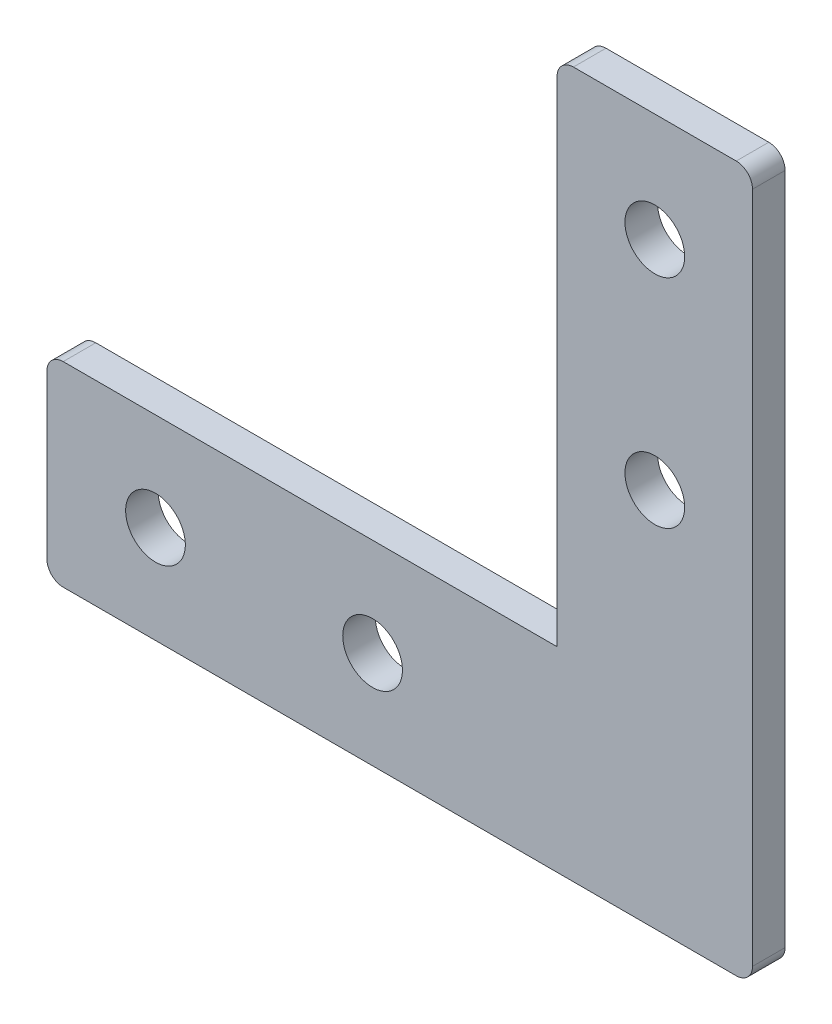
ISO-10303-21;
HEADER;
FILE_DESCRIPTION(('STEP AP214'),'2;1');
FILE_NAME('part.step','',(''),(''),'','','');
FILE_SCHEMA(('AUTOMOTIVE_DESIGN { 1 0 10303 214 1 1 1 1 }'));
ENDSEC;
DATA;
#1=APPLICATION_CONTEXT('core data for automotive mechanical design processes');
#2=APPLICATION_PROTOCOL_DEFINITION('international standard','automotive_design',2000,#1);
#3=PRODUCT_CONTEXT('',#1,'mechanical');
#4=PRODUCT('Part','Part','',(#3));
#5=PRODUCT_RELATED_PRODUCT_CATEGORY('part','',(#4));
#6=PRODUCT_DEFINITION_FORMATION('','',#4);
#7=PRODUCT_DEFINITION_CONTEXT('part definition',#1,'design');
#8=PRODUCT_DEFINITION('design','',#6,#7);
#9=PRODUCT_DEFINITION_SHAPE('','',#8);
#10=(LENGTH_UNIT() NAMED_UNIT(*) SI_UNIT(.MILLI.,.METRE.));
#11=(NAMED_UNIT(*) PLANE_ANGLE_UNIT() SI_UNIT($,.RADIAN.));
#12=(NAMED_UNIT(*) SI_UNIT($,.STERADIAN.) SOLID_ANGLE_UNIT());
#13=UNCERTAINTY_MEASURE_WITH_UNIT(LENGTH_MEASURE(1.E-05),#10,'distance_accuracy_value','');
#14=(GEOMETRIC_REPRESENTATION_CONTEXT(3) GLOBAL_UNCERTAINTY_ASSIGNED_CONTEXT((#13)) GLOBAL_UNIT_ASSIGNED_CONTEXT((#10,
#11,#12)) REPRESENTATION_CONTEXT('',''));
#15=CARTESIAN_POINT('',(0.,0.,0.));
#16=DIRECTION('',(0.,0.,1.));
#17=DIRECTION('',(1.,0.,0.));
#18=AXIS2_PLACEMENT_3D('',#15,#16,#17);
#19=CARTESIAN_POINT('',(1.5,16.5,-3.));
#20=DIRECTION('',(0.,0.,1.));
#21=DIRECTION('',(1.,0.,0.));
#22=AXIS2_PLACEMENT_3D('',#19,#20,#21);
#23=CYLINDRICAL_SURFACE('',#22,1.5);
#24=CARTESIAN_POINT('',(1.5,16.5,0.));
#25=DIRECTION('',(0.,0.,1.));
#26=DIRECTION('',(1.,0.,0.));
#27=AXIS2_PLACEMENT_3D('',#24,#25,#26);
#28=CIRCLE('',#27,1.5);
#29=CARTESIAN_POINT('',(1.5,18.,0.));
#30=VERTEX_POINT('',#29);
#31=CARTESIAN_POINT('',(0.,16.5,0.));
#32=VERTEX_POINT('',#31);
#33=EDGE_CURVE('E156',#30,#32,#28,.T.);
#34=ORIENTED_EDGE('',*,*,#33,.F.);
#35=DIRECTION('',(0.,0.,1.));
#36=VECTOR('',#35,1.);
#37=CARTESIAN_POINT('',(1.5,18.,-3.));
#38=LINE('',#37,#36);
#39=CARTESIAN_POINT('',(1.5,18.,-3.));
#40=VERTEX_POINT('',#39);
#41=EDGE_CURVE('E11',#40,#30,#38,.T.);
#42=ORIENTED_EDGE('',*,*,#41,.F.);
#43=CARTESIAN_POINT('',(1.5,16.5,-3.));
#44=DIRECTION('',(0.,0.,1.));
#45=DIRECTION('',(1.,0.,0.));
#46=AXIS2_PLACEMENT_3D('',#43,#44,#45);
#47=CIRCLE('',#46,1.5);
#48=CARTESIAN_POINT('',(0.,16.5,-3.));
#49=VERTEX_POINT('',#48);
#50=EDGE_CURVE('E186',#40,#49,#47,.T.);
#51=ORIENTED_EDGE('',*,*,#50,.T.);
#52=DIRECTION('',(0.,0.,1.));
#53=VECTOR('',#52,1.);
#54=CARTESIAN_POINT('',(0.,16.5,-3.));
#55=LINE('',#54,#53);
#56=EDGE_CURVE('E44',#49,#32,#55,.T.);
#57=ORIENTED_EDGE('',*,*,#56,.T.);
#58=EDGE_LOOP('',(#34,#42,#51,#57));
#59=FACE_BOUND('',#58,.T.);
#60=ADVANCED_FACE('F41',(#59),#23,.T.);
#61=CARTESIAN_POINT('',(47.,18.,-3.));
#62=DIRECTION('',(0.,1.,0.));
#63=DIRECTION('',(0.,0.,1.));
#64=AXIS2_PLACEMENT_3D('',#61,#62,#63);
#65=PLANE('',#64);
#66=DIRECTION('',(-1.,0.,0.));
#67=VECTOR('',#66,1.);
#68=CARTESIAN_POINT('',(47.,18.,0.));
#69=LINE('',#68,#67);
#70=CARTESIAN_POINT('',(47.,18.,0.));
#71=VERTEX_POINT('',#70);
#72=EDGE_CURVE('E184',#71,#30,#69,.T.);
#73=ORIENTED_EDGE('',*,*,#72,.F.);
#74=DIRECTION('',(0.,0.,1.));
#75=VECTOR('',#74,1.);
#76=CARTESIAN_POINT('',(47.,18.,-3.));
#77=LINE('',#76,#75);
#78=CARTESIAN_POINT('',(47.,18.,-3.));
#79=VERTEX_POINT('',#78);
#80=EDGE_CURVE('E50',#79,#71,#77,.T.);
#81=ORIENTED_EDGE('',*,*,#80,.F.);
#82=DIRECTION('',(-1.,0.,0.));
#83=VECTOR('',#82,1.);
#84=CARTESIAN_POINT('',(47.,18.,-3.));
#85=LINE('',#84,#83);
#86=EDGE_CURVE('E146',#79,#40,#85,.T.);
#87=ORIENTED_EDGE('',*,*,#86,.T.);
#88=ORIENTED_EDGE('',*,*,#41,.T.);
#89=EDGE_LOOP('',(#73,#81,#87,#88));
#90=FACE_BOUND('',#89,.T.);
#91=ADVANCED_FACE('F204',(#90),#65,.T.);
#92=CARTESIAN_POINT('',(47.,63.5,-3.));
#93=DIRECTION('',(-1.,0.,0.));
#94=DIRECTION('',(0.,0.,1.));
#95=AXIS2_PLACEMENT_3D('',#92,#93,#94);
#96=PLANE('',#95);
#97=DIRECTION('',(0.,-1.,0.));
#98=VECTOR('',#97,1.);
#99=CARTESIAN_POINT('',(47.,63.5,0.));
#100=LINE('',#99,#98);
#101=CARTESIAN_POINT('',(47.,63.5,0.));
#102=VERTEX_POINT('',#101);
#103=EDGE_CURVE('E133',#102,#71,#100,.T.);
#104=ORIENTED_EDGE('',*,*,#103,.F.);
#105=DIRECTION('',(0.,0.,1.));
#106=VECTOR('',#105,1.);
#107=CARTESIAN_POINT('',(47.,63.5,-3.));
#108=LINE('',#107,#106);
#109=CARTESIAN_POINT('',(47.,63.5,-3.));
#110=VERTEX_POINT('',#109);
#111=EDGE_CURVE('E128',#110,#102,#108,.T.);
#112=ORIENTED_EDGE('',*,*,#111,.F.);
#113=DIRECTION('',(0.,-1.,0.));
#114=VECTOR('',#113,1.);
#115=CARTESIAN_POINT('',(47.,63.5,-3.));
#116=LINE('',#115,#114);
#117=EDGE_CURVE('E131',#110,#79,#116,.T.);
#118=ORIENTED_EDGE('',*,*,#117,.T.);
#119=ORIENTED_EDGE('',*,*,#80,.T.);
#120=EDGE_LOOP('',(#104,#112,#118,#119));
#121=FACE_BOUND('',#120,.T.);
#122=ADVANCED_FACE('F130',(#121),#96,.T.);
#123=CARTESIAN_POINT('',(48.5,63.5,-3.));
#124=DIRECTION('',(0.,0.,1.));
#125=DIRECTION('',(1.,0.,0.));
#126=AXIS2_PLACEMENT_3D('',#123,#124,#125);
#127=CYLINDRICAL_SURFACE('',#126,1.5);
#128=CARTESIAN_POINT('',(48.5,63.5,0.));
#129=DIRECTION('',(0.,0.,1.));
#130=DIRECTION('',(1.,0.,0.));
#131=AXIS2_PLACEMENT_3D('',#128,#129,#130);
#132=CIRCLE('',#131,1.5);
#133=CARTESIAN_POINT('',(48.5,65.,0.));
#134=VERTEX_POINT('',#133);
#135=EDGE_CURVE('E181',#134,#102,#132,.T.);
#136=ORIENTED_EDGE('',*,*,#135,.F.);
#137=DIRECTION('',(0.,0.,1.));
#138=VECTOR('',#137,1.);
#139=CARTESIAN_POINT('',(48.5,65.,-3.));
#140=LINE('',#139,#138);
#141=CARTESIAN_POINT('',(48.5,65.,-3.));
#142=VERTEX_POINT('',#141);
#143=EDGE_CURVE('E138',#142,#134,#140,.T.);
#144=ORIENTED_EDGE('',*,*,#143,.F.);
#145=CARTESIAN_POINT('',(48.5,63.5,-3.));
#146=DIRECTION('',(0.,0.,1.));
#147=DIRECTION('',(1.,0.,0.));
#148=AXIS2_PLACEMENT_3D('',#145,#146,#147);
#149=CIRCLE('',#148,1.5);
#150=EDGE_CURVE('E144',#142,#110,#149,.T.);
#151=ORIENTED_EDGE('',*,*,#150,.T.);
#152=ORIENTED_EDGE('',*,*,#111,.T.);
#153=EDGE_LOOP('',(#136,#144,#151,#152));
#154=FACE_BOUND('',#153,.T.);
#155=ADVANCED_FACE('F148',(#154),#127,.T.);
#156=CARTESIAN_POINT('',(63.5,65.,-3.));
#157=DIRECTION('',(0.,1.,0.));
#158=DIRECTION('',(0.,0.,1.));
#159=AXIS2_PLACEMENT_3D('',#156,#157,#158);
#160=PLANE('',#159);
#161=DIRECTION('',(-1.,0.,0.));
#162=VECTOR('',#161,1.);
#163=CARTESIAN_POINT('',(63.5,65.,0.));
#164=LINE('',#163,#162);
#165=CARTESIAN_POINT('',(63.5,65.,0.));
#166=VERTEX_POINT('',#165);
#167=EDGE_CURVE('E178',#166,#134,#164,.T.);
#168=ORIENTED_EDGE('',*,*,#167,.F.);
#169=DIRECTION('',(0.,0.,1.));
#170=VECTOR('',#169,1.);
#171=CARTESIAN_POINT('',(63.5,65.,-3.));
#172=LINE('',#171,#170);
#173=CARTESIAN_POINT('',(63.5,65.,-3.));
#174=VERTEX_POINT('',#173);
#175=EDGE_CURVE('E190',#174,#166,#172,.T.);
#176=ORIENTED_EDGE('',*,*,#175,.F.);
#177=DIRECTION('',(-1.,0.,0.));
#178=VECTOR('',#177,1.);
#179=CARTESIAN_POINT('',(63.5,65.,-3.));
#180=LINE('',#179,#178);
#181=EDGE_CURVE('E149',#174,#142,#180,.T.);
#182=ORIENTED_EDGE('',*,*,#181,.T.);
#183=ORIENTED_EDGE('',*,*,#143,.T.);
#184=EDGE_LOOP('',(#168,#176,#182,#183));
#185=FACE_BOUND('',#184,.T.);
#186=ADVANCED_FACE('F217',(#185),#160,.T.);
#187=CARTESIAN_POINT('',(63.5,63.5,-3.));
#188=DIRECTION('',(0.,0.,1.));
#189=DIRECTION('',(1.,0.,0.));
#190=AXIS2_PLACEMENT_3D('',#187,#188,#189);
#191=CYLINDRICAL_SURFACE('',#190,1.5);
#192=CARTESIAN_POINT('',(63.5,63.5,0.));
#193=DIRECTION('',(0.,0.,1.));
#194=DIRECTION('',(1.,0.,0.));
#195=AXIS2_PLACEMENT_3D('',#192,#193,#194);
#196=CIRCLE('',#195,1.5);
#197=CARTESIAN_POINT('',(65.,63.5,0.));
#198=VERTEX_POINT('',#197);
#199=EDGE_CURVE('E175',#198,#166,#196,.T.);
#200=ORIENTED_EDGE('',*,*,#199,.F.);
#201=DIRECTION('',(0.,0.,1.));
#202=VECTOR('',#201,1.);
#203=CARTESIAN_POINT('',(65.,63.5,-3.));
#204=LINE('',#203,#202);
#205=CARTESIAN_POINT('',(65.,63.5,-3.));
#206=VERTEX_POINT('',#205);
#207=EDGE_CURVE('E192',#206,#198,#204,.T.);
#208=ORIENTED_EDGE('',*,*,#207,.F.);
#209=CARTESIAN_POINT('',(63.5,63.5,-3.));
#210=DIRECTION('',(0.,0.,1.));
#211=DIRECTION('',(1.,0.,0.));
#212=AXIS2_PLACEMENT_3D('',#209,#210,#211);
#213=CIRCLE('',#212,1.5);
#214=EDGE_CURVE('E151',#206,#174,#213,.T.);
#215=ORIENTED_EDGE('',*,*,#214,.T.);
#216=ORIENTED_EDGE('',*,*,#175,.T.);
#217=EDGE_LOOP('',(#200,#208,#215,#216));
#218=FACE_BOUND('',#217,.T.);
#219=ADVANCED_FACE('F220',(#218),#191,.T.);
#220=CARTESIAN_POINT('',(65.,1.5,-3.));
#221=DIRECTION('',(1.,0.,0.));
#222=DIRECTION('',(0.,0.,-1.));
#223=AXIS2_PLACEMENT_3D('',#220,#221,#222);
#224=PLANE('',#223);
#225=DIRECTION('',(0.,1.,0.));
#226=VECTOR('',#225,1.);
#227=CARTESIAN_POINT('',(65.,1.5,0.));
#228=LINE('',#227,#226);
#229=CARTESIAN_POINT('',(65.,1.5,0.));
#230=VERTEX_POINT('',#229);
#231=EDGE_CURVE('E172',#230,#198,#228,.T.);
#232=ORIENTED_EDGE('',*,*,#231,.F.);
#233=DIRECTION('',(0.,0.,1.));
#234=VECTOR('',#233,1.);
#235=CARTESIAN_POINT('',(65.,1.5,-3.));
#236=LINE('',#235,#234);
#237=CARTESIAN_POINT('',(65.,1.5,-3.));
#238=VERTEX_POINT('',#237);
#239=EDGE_CURVE('E194',#238,#230,#236,.T.);
#240=ORIENTED_EDGE('',*,*,#239,.F.);
#241=DIRECTION('',(0.,1.,0.));
#242=VECTOR('',#241,1.);
#243=CARTESIAN_POINT('',(65.,1.5,-3.));
#244=LINE('',#243,#242);
#245=EDGE_CURVE('E307',#238,#206,#244,.T.);
#246=ORIENTED_EDGE('',*,*,#245,.T.);
#247=ORIENTED_EDGE('',*,*,#207,.T.);
#248=EDGE_LOOP('',(#232,#240,#246,#247));
#249=FACE_BOUND('',#248,.T.);
#250=ADVANCED_FACE('F224',(#249),#224,.T.);
#251=CARTESIAN_POINT('',(63.5,1.5,-3.));
#252=DIRECTION('',(0.,0.,1.));
#253=DIRECTION('',(1.,0.,0.));
#254=AXIS2_PLACEMENT_3D('',#251,#252,#253);
#255=CYLINDRICAL_SURFACE('',#254,1.5);
#256=CARTESIAN_POINT('',(63.5,1.5,0.));
#257=DIRECTION('',(0.,0.,1.));
#258=DIRECTION('',(1.,0.,0.));
#259=AXIS2_PLACEMENT_3D('',#256,#257,#258);
#260=CIRCLE('',#259,1.5);
#261=CARTESIAN_POINT('',(63.5,0.,0.));
#262=VERTEX_POINT('',#261);
#263=EDGE_CURVE('E169',#262,#230,#260,.T.);
#264=ORIENTED_EDGE('',*,*,#263,.F.);
#265=DIRECTION('',(0.,0.,1.));
#266=VECTOR('',#265,1.);
#267=CARTESIAN_POINT('',(63.5,0.,-3.));
#268=LINE('',#267,#266);
#269=CARTESIAN_POINT('',(63.5,0.,-3.));
#270=VERTEX_POINT('',#269);
#271=EDGE_CURVE('E196',#270,#262,#268,.T.);
#272=ORIENTED_EDGE('',*,*,#271,.F.);
#273=CARTESIAN_POINT('',(63.5,1.5,-3.));
#274=DIRECTION('',(0.,0.,1.));
#275=DIRECTION('',(1.,0.,0.));
#276=AXIS2_PLACEMENT_3D('',#273,#274,#275);
#277=CIRCLE('',#276,1.5);
#278=EDGE_CURVE('E304',#270,#238,#277,.T.);
#279=ORIENTED_EDGE('',*,*,#278,.T.);
#280=ORIENTED_EDGE('',*,*,#239,.T.);
#281=EDGE_LOOP('',(#264,#272,#279,#280));
#282=FACE_BOUND('',#281,.T.);
#283=ADVANCED_FACE('F228',(#282),#255,.T.);
#284=CARTESIAN_POINT('',(1.5,0.,-3.));
#285=DIRECTION('',(0.,-1.,0.));
#286=DIRECTION('',(1.,0.,0.));
#287=AXIS2_PLACEMENT_3D('',#284,#285,#286);
#288=PLANE('',#287);
#289=DIRECTION('',(1.,0.,0.));
#290=VECTOR('',#289,1.);
#291=CARTESIAN_POINT('',(1.5,0.,0.));
#292=LINE('',#291,#290);
#293=CARTESIAN_POINT('',(1.5,0.,0.));
#294=VERTEX_POINT('',#293);
#295=EDGE_CURVE('E166',#294,#262,#292,.T.);
#296=ORIENTED_EDGE('',*,*,#295,.F.);
#297=DIRECTION('',(0.,0.,1.));
#298=VECTOR('',#297,1.);
#299=CARTESIAN_POINT('',(1.5,0.,-3.));
#300=LINE('',#299,#298);
#301=CARTESIAN_POINT('',(1.5,0.,-3.));
#302=VERTEX_POINT('',#301);
#303=EDGE_CURVE('E198',#302,#294,#300,.T.);
#304=ORIENTED_EDGE('',*,*,#303,.F.);
#305=DIRECTION('',(1.,0.,0.));
#306=VECTOR('',#305,1.);
#307=CARTESIAN_POINT('',(1.5,0.,-3.));
#308=LINE('',#307,#306);
#309=EDGE_CURVE('E301',#302,#270,#308,.T.);
#310=ORIENTED_EDGE('',*,*,#309,.T.);
#311=ORIENTED_EDGE('',*,*,#271,.T.);
#312=EDGE_LOOP('',(#296,#304,#310,#311));
#313=FACE_BOUND('',#312,.T.);
#314=ADVANCED_FACE('F232',(#313),#288,.T.);
#315=CARTESIAN_POINT('',(1.5,1.5,-3.));
#316=DIRECTION('',(0.,0.,1.));
#317=DIRECTION('',(1.,0.,0.));
#318=AXIS2_PLACEMENT_3D('',#315,#316,#317);
#319=CYLINDRICAL_SURFACE('',#318,1.5);
#320=CARTESIAN_POINT('',(1.5,1.5,0.));
#321=DIRECTION('',(0.,0.,1.));
#322=DIRECTION('',(1.,0.,0.));
#323=AXIS2_PLACEMENT_3D('',#320,#321,#322);
#324=CIRCLE('',#323,1.5);
#325=CARTESIAN_POINT('',(0.,1.5,0.));
#326=VERTEX_POINT('',#325);
#327=EDGE_CURVE('E163',#326,#294,#324,.T.);
#328=ORIENTED_EDGE('',*,*,#327,.F.);
#329=DIRECTION('',(0.,0.,1.));
#330=VECTOR('',#329,1.);
#331=CARTESIAN_POINT('',(0.,1.5,-3.));
#332=LINE('',#331,#330);
#333=CARTESIAN_POINT('',(0.,1.5,-3.));
#334=VERTEX_POINT('',#333);
#335=EDGE_CURVE('E199',#334,#326,#332,.T.);
#336=ORIENTED_EDGE('',*,*,#335,.F.);
#337=CARTESIAN_POINT('',(1.5,1.5,-3.));
#338=DIRECTION('',(0.,0.,1.));
#339=DIRECTION('',(1.,0.,0.));
#340=AXIS2_PLACEMENT_3D('',#337,#338,#339);
#341=CIRCLE('',#340,1.5);
#342=EDGE_CURVE('E298',#334,#302,#341,.T.);
#343=ORIENTED_EDGE('',*,*,#342,.T.);
#344=ORIENTED_EDGE('',*,*,#303,.T.);
#345=EDGE_LOOP('',(#328,#336,#343,#344));
#346=FACE_BOUND('',#345,.T.);
#347=ADVANCED_FACE('F236',(#346),#319,.T.);
#348=CARTESIAN_POINT('',(0.,16.5,-3.));
#349=DIRECTION('',(-1.,0.,0.));
#350=DIRECTION('',(0.,0.,1.));
#351=AXIS2_PLACEMENT_3D('',#348,#349,#350);
#352=PLANE('',#351);
#353=DIRECTION('',(0.,-1.,0.));
#354=VECTOR('',#353,1.);
#355=CARTESIAN_POINT('',(0.,16.5,0.));
#356=LINE('',#355,#354);
#357=EDGE_CURVE('E159',#32,#326,#356,.T.);
#358=ORIENTED_EDGE('',*,*,#357,.F.);
#359=ORIENTED_EDGE('',*,*,#56,.F.);
#360=DIRECTION('',(0.,-1.,0.));
#361=VECTOR('',#360,1.);
#362=CARTESIAN_POINT('',(0.,16.5,-3.));
#363=LINE('',#362,#361);
#364=EDGE_CURVE('E296',#49,#334,#363,.T.);
#365=ORIENTED_EDGE('',*,*,#364,.T.);
#366=ORIENTED_EDGE('',*,*,#335,.T.);
#367=EDGE_LOOP('',(#358,#359,#365,#366));
#368=FACE_BOUND('',#367,.T.);
#369=ADVANCED_FACE('F201',(#368),#352,.T.);
#370=CARTESIAN_POINT('',(1.5,16.5,-3.));
#371=DIRECTION('',(0.,0.,1.));
#372=DIRECTION('',(1.,0.,0.));
#373=AXIS2_PLACEMENT_3D('',#370,#371,#372);
#374=PLANE('',#373);
#375=CARTESIAN_POINT('',(56.,55.,-3.));
#376=DIRECTION('',(0.,0.,1.));
#377=DIRECTION('',(-1.,0.,0.));
#378=AXIS2_PLACEMENT_3D('',#375,#376,#377);
#379=CIRCLE('',#378,2.75);
#380=CARTESIAN_POINT('',(53.25,55.,-3.));
#381=VERTEX_POINT('',#380);
#382=EDGE_CURVE('E271',#381,#381,#379,.T.);
#383=ORIENTED_EDGE('',*,*,#382,.T.);
#384=EDGE_LOOP('',(#383));
#385=FACE_BOUND('',#384,.T.);
#386=CARTESIAN_POINT('',(56.,35.,-3.));
#387=DIRECTION('',(0.,0.,1.));
#388=DIRECTION('',(-1.,0.,0.));
#389=AXIS2_PLACEMENT_3D('',#386,#387,#388);
#390=CIRCLE('',#389,2.75);
#391=CARTESIAN_POINT('',(53.25,35.,-3.));
#392=VERTEX_POINT('',#391);
#393=EDGE_CURVE('E279',#392,#392,#390,.T.);
#394=ORIENTED_EDGE('',*,*,#393,.T.);
#395=EDGE_LOOP('',(#394));
#396=FACE_BOUND('',#395,.T.);
#397=CARTESIAN_POINT('',(30.,9.,-3.));
#398=DIRECTION('',(0.,0.,1.));
#399=DIRECTION('',(-1.,0.,0.));
#400=AXIS2_PLACEMENT_3D('',#397,#398,#399);
#401=CIRCLE('',#400,2.75);
#402=CARTESIAN_POINT('',(27.25,9.,-3.));
#403=VERTEX_POINT('',#402);
#404=EDGE_CURVE('E285',#403,#403,#401,.T.);
#405=ORIENTED_EDGE('',*,*,#404,.T.);
#406=EDGE_LOOP('',(#405));
#407=FACE_BOUND('',#406,.T.);
#408=CARTESIAN_POINT('',(10.,9.,-3.));
#409=DIRECTION('',(0.,0.,1.));
#410=DIRECTION('',(-1.,0.,0.));
#411=AXIS2_PLACEMENT_3D('',#408,#409,#410);
#412=CIRCLE('',#411,2.75);
#413=CARTESIAN_POINT('',(7.25,9.,-3.));
#414=VERTEX_POINT('',#413);
#415=EDGE_CURVE('E160',#414,#414,#412,.T.);
#416=ORIENTED_EDGE('',*,*,#415,.T.);
#417=EDGE_LOOP('',(#416));
#418=FACE_BOUND('',#417,.T.);
#419=ORIENTED_EDGE('',*,*,#50,.F.);
#420=ORIENTED_EDGE('',*,*,#86,.F.);
#421=ORIENTED_EDGE('',*,*,#117,.F.);
#422=ORIENTED_EDGE('',*,*,#150,.F.);
#423=ORIENTED_EDGE('',*,*,#181,.F.);
#424=ORIENTED_EDGE('',*,*,#214,.F.);
#425=ORIENTED_EDGE('',*,*,#245,.F.);
#426=ORIENTED_EDGE('',*,*,#278,.F.);
#427=ORIENTED_EDGE('',*,*,#309,.F.);
#428=ORIENTED_EDGE('',*,*,#342,.F.);
#429=ORIENTED_EDGE('',*,*,#364,.F.);
#430=EDGE_LOOP('',(#419,#420,#421,#422,#423,#424,#425,#426,#427,#428,#429));
#431=FACE_BOUND('',#430,.T.);
#432=ADVANCED_FACE('F142',(#385,#396,#407,#418,#431),#374,.F.);
#433=CARTESIAN_POINT('',(1.5,16.5,0.));
#434=DIRECTION('',(0.,0.,1.));
#435=DIRECTION('',(1.,0.,0.));
#436=AXIS2_PLACEMENT_3D('',#433,#434,#435);
#437=PLANE('',#436);
#438=CARTESIAN_POINT('',(56.,55.,0.));
#439=DIRECTION('',(0.,0.,1.));
#440=DIRECTION('',(-1.,0.,0.));
#441=AXIS2_PLACEMENT_3D('',#438,#439,#440);
#442=CIRCLE('',#441,2.75);
#443=CARTESIAN_POINT('',(53.25,55.,0.));
#444=VERTEX_POINT('',#443);
#445=EDGE_CURVE('E274',#444,#444,#442,.T.);
#446=ORIENTED_EDGE('',*,*,#445,.F.);
#447=EDGE_LOOP('',(#446));
#448=FACE_BOUND('',#447,.T.);
#449=CARTESIAN_POINT('',(56.,35.,0.));
#450=DIRECTION('',(0.,0.,1.));
#451=DIRECTION('',(-1.,0.,0.));
#452=AXIS2_PLACEMENT_3D('',#449,#450,#451);
#453=CIRCLE('',#452,2.75);
#454=CARTESIAN_POINT('',(53.25,35.,0.));
#455=VERTEX_POINT('',#454);
#456=EDGE_CURVE('E276',#455,#455,#453,.T.);
#457=ORIENTED_EDGE('',*,*,#456,.F.);
#458=EDGE_LOOP('',(#457));
#459=FACE_BOUND('',#458,.T.);
#460=CARTESIAN_POINT('',(30.,9.,0.));
#461=DIRECTION('',(0.,0.,1.));
#462=DIRECTION('',(-1.,0.,0.));
#463=AXIS2_PLACEMENT_3D('',#460,#461,#462);
#464=CIRCLE('',#463,2.75);
#465=CARTESIAN_POINT('',(27.25,9.,0.));
#466=VERTEX_POINT('',#465);
#467=EDGE_CURVE('E282',#466,#466,#464,.T.);
#468=ORIENTED_EDGE('',*,*,#467,.F.);
#469=EDGE_LOOP('',(#468));
#470=FACE_BOUND('',#469,.T.);
#471=CARTESIAN_POINT('',(10.,9.,0.));
#472=DIRECTION('',(0.,0.,1.));
#473=DIRECTION('',(-1.,0.,0.));
#474=AXIS2_PLACEMENT_3D('',#471,#472,#473);
#475=CIRCLE('',#474,2.75);
#476=CARTESIAN_POINT('',(7.25,9.,0.));
#477=VERTEX_POINT('',#476);
#478=EDGE_CURVE('E288',#477,#477,#475,.T.);
#479=ORIENTED_EDGE('',*,*,#478,.F.);
#480=EDGE_LOOP('',(#479));
#481=FACE_BOUND('',#480,.T.);
#482=ORIENTED_EDGE('',*,*,#33,.T.);
#483=ORIENTED_EDGE('',*,*,#357,.T.);
#484=ORIENTED_EDGE('',*,*,#327,.T.);
#485=ORIENTED_EDGE('',*,*,#295,.T.);
#486=ORIENTED_EDGE('',*,*,#263,.T.);
#487=ORIENTED_EDGE('',*,*,#231,.T.);
#488=ORIENTED_EDGE('',*,*,#199,.T.);
#489=ORIENTED_EDGE('',*,*,#167,.T.);
#490=ORIENTED_EDGE('',*,*,#135,.T.);
#491=ORIENTED_EDGE('',*,*,#103,.T.);
#492=ORIENTED_EDGE('',*,*,#72,.T.);
#493=EDGE_LOOP('',(#482,#483,#484,#485,#486,#487,#488,#489,#490,#491,#492));
#494=FACE_BOUND('',#493,.T.);
#495=ADVANCED_FACE('F203',(#448,#459,#470,#481,#494),#437,.T.);
#496=CARTESIAN_POINT('',(10.,9.,-3.));
#497=DIRECTION('',(0.,0.,1.));
#498=DIRECTION('',(1.,0.,0.));
#499=AXIS2_PLACEMENT_3D('',#496,#497,#498);
#500=CYLINDRICAL_SURFACE('',#499,2.75);
#501=ORIENTED_EDGE('',*,*,#415,.F.);
#502=EDGE_LOOP('',(#501));
#503=FACE_BOUND('',#502,.T.);
#504=ORIENTED_EDGE('',*,*,#478,.T.);
#505=EDGE_LOOP('',(#504));
#506=FACE_BOUND('',#505,.T.);
#507=ADVANCED_FACE('F248',(#503,#506),#500,.F.);
#508=CARTESIAN_POINT('',(30.,9.,-3.));
#509=DIRECTION('',(0.,0.,1.));
#510=DIRECTION('',(1.,0.,0.));
#511=AXIS2_PLACEMENT_3D('',#508,#509,#510);
#512=CYLINDRICAL_SURFACE('',#511,2.75);
#513=ORIENTED_EDGE('',*,*,#404,.F.);
#514=EDGE_LOOP('',(#513));
#515=FACE_BOUND('',#514,.T.);
#516=ORIENTED_EDGE('',*,*,#467,.T.);
#517=EDGE_LOOP('',(#516));
#518=FACE_BOUND('',#517,.T.);
#519=ADVANCED_FACE('F255',(#515,#518),#512,.F.);
#520=CARTESIAN_POINT('',(56.,35.,-3.));
#521=DIRECTION('',(0.,0.,1.));
#522=DIRECTION('',(1.,0.,0.));
#523=AXIS2_PLACEMENT_3D('',#520,#521,#522);
#524=CYLINDRICAL_SURFACE('',#523,2.75);
#525=ORIENTED_EDGE('',*,*,#393,.F.);
#526=EDGE_LOOP('',(#525));
#527=FACE_BOUND('',#526,.T.);
#528=ORIENTED_EDGE('',*,*,#456,.T.);
#529=EDGE_LOOP('',(#528));
#530=FACE_BOUND('',#529,.T.);
#531=ADVANCED_FACE('F259',(#527,#530),#524,.F.);
#532=CARTESIAN_POINT('',(56.,55.,-3.));
#533=DIRECTION('',(0.,0.,1.));
#534=DIRECTION('',(1.,0.,0.));
#535=AXIS2_PLACEMENT_3D('',#532,#533,#534);
#536=CYLINDRICAL_SURFACE('',#535,2.75);
#537=ORIENTED_EDGE('',*,*,#382,.F.);
#538=EDGE_LOOP('',(#537));
#539=FACE_BOUND('',#538,.T.);
#540=ORIENTED_EDGE('',*,*,#445,.T.);
#541=EDGE_LOOP('',(#540));
#542=FACE_BOUND('',#541,.T.);
#543=ADVANCED_FACE('F263',(#539,#542),#536,.F.);
#544=CLOSED_SHELL('',(#60,#91,#122,#155,#186,#219,#250,#283,#314,#347,#369,#432,#495,#507,#519,
#531,#543));
#545=MANIFOLD_SOLID_BREP('B2',#544);
#546=ADVANCED_BREP_SHAPE_REPRESENTATION('',(#18,#545),#14);
#547=SHAPE_DEFINITION_REPRESENTATION(#9,#546);
ENDSEC;
END-ISO-10303-21;
